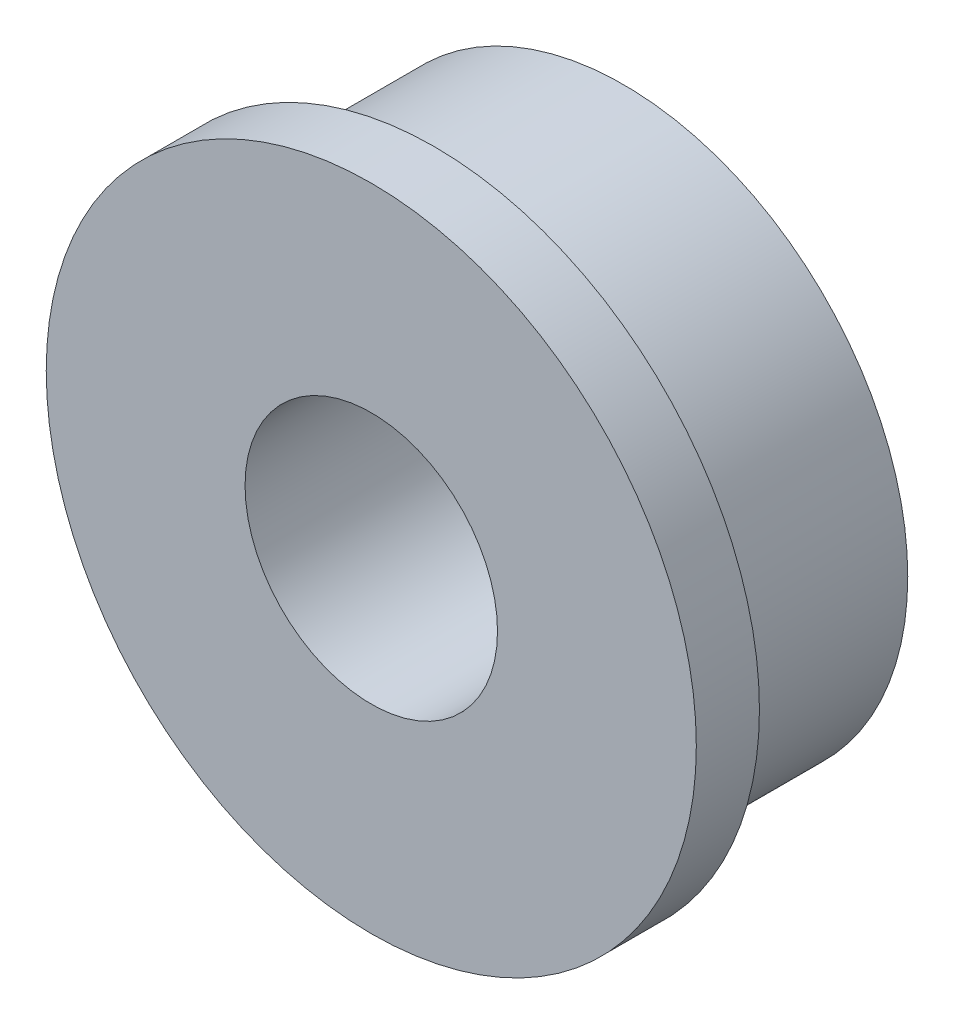
ISO-10303-21;
HEADER;
FILE_DESCRIPTION(('STEP AP214'),'2;1');
FILE_NAME('part.step','',(''),(''),'','','');
FILE_SCHEMA(('AUTOMOTIVE_DESIGN { 1 0 10303 214 1 1 1 1 }'));
ENDSEC;
DATA;
#1=APPLICATION_CONTEXT('core data for automotive mechanical design processes');
#2=APPLICATION_PROTOCOL_DEFINITION('international standard','automotive_design',2000,#1);
#3=PRODUCT_CONTEXT('',#1,'mechanical');
#4=PRODUCT('Part','Part','',(#3));
#5=PRODUCT_RELATED_PRODUCT_CATEGORY('part','',(#4));
#6=PRODUCT_DEFINITION_FORMATION('','',#4);
#7=PRODUCT_DEFINITION_CONTEXT('part definition',#1,'design');
#8=PRODUCT_DEFINITION('design','',#6,#7);
#9=PRODUCT_DEFINITION_SHAPE('','',#8);
#10=(LENGTH_UNIT() NAMED_UNIT(*) SI_UNIT(.MILLI.,.METRE.));
#11=(NAMED_UNIT(*) PLANE_ANGLE_UNIT() SI_UNIT($,.RADIAN.));
#12=(NAMED_UNIT(*) SI_UNIT($,.STERADIAN.) SOLID_ANGLE_UNIT());
#13=UNCERTAINTY_MEASURE_WITH_UNIT(LENGTH_MEASURE(1.E-05),#10,'distance_accuracy_value','');
#14=(GEOMETRIC_REPRESENTATION_CONTEXT(3) GLOBAL_UNCERTAINTY_ASSIGNED_CONTEXT((#13)) GLOBAL_UNIT_ASSIGNED_CONTEXT((#10,
#11,#12)) REPRESENTATION_CONTEXT('',''));
#15=CARTESIAN_POINT('',(0.,0.,0.));
#16=DIRECTION('',(0.,0.,1.));
#17=DIRECTION('',(1.,0.,0.));
#18=AXIS2_PLACEMENT_3D('',#15,#16,#17);
#19=CARTESIAN_POINT('',(0.,0.,0.));
#20=DIRECTION('',(0.,0.,1.));
#21=DIRECTION('',(1.,0.,0.));
#22=AXIS2_PLACEMENT_3D('',#19,#20,#21);
#23=PLANE('',#22);
#24=CARTESIAN_POINT('',(0.,0.,0.));
#25=DIRECTION('',(0.,0.,1.));
#26=DIRECTION('',(1.,0.,0.));
#27=AXIS2_PLACEMENT_3D('',#24,#25,#26);
#28=CIRCLE('',#27,4.5);
#29=CARTESIAN_POINT('',(4.5,0.,0.));
#30=VERTEX_POINT('',#29);
#31=EDGE_CURVE('E41',#30,#30,#28,.T.);
#32=ORIENTED_EDGE('',*,*,#31,.F.);
#33=EDGE_LOOP('',(#32));
#34=FACE_BOUND('',#33,.T.);
#35=CARTESIAN_POINT('',(0.,0.,0.));
#36=DIRECTION('',(0.,0.,1.));
#37=DIRECTION('',(1.,0.,0.));
#38=AXIS2_PLACEMENT_3D('',#35,#36,#37);
#39=CIRCLE('',#38,2.);
#40=CARTESIAN_POINT('',(2.,0.,0.));
#41=VERTEX_POINT('',#40);
#42=EDGE_CURVE('E48',#41,#41,#39,.T.);
#43=ORIENTED_EDGE('',*,*,#42,.T.);
#44=EDGE_LOOP('',(#43));
#45=FACE_BOUND('',#44,.T.);
#46=ADVANCED_FACE('F37',(#34,#45),#23,.F.);
#47=CARTESIAN_POINT('',(0.,0.,3.));
#48=DIRECTION('',(0.,0.,-1.));
#49=DIRECTION('',(-1.,0.,0.));
#50=AXIS2_PLACEMENT_3D('',#47,#48,#49);
#51=CYLINDRICAL_SURFACE('',#50,4.5);
#52=CARTESIAN_POINT('',(0.,0.,3.));
#53=DIRECTION('',(0.,0.,1.));
#54=DIRECTION('',(1.,0.,0.));
#55=AXIS2_PLACEMENT_3D('',#52,#53,#54);
#56=CIRCLE('',#55,4.5);
#57=CARTESIAN_POINT('',(4.5,0.,3.));
#58=VERTEX_POINT('',#57);
#59=EDGE_CURVE('E10',#58,#58,#56,.T.);
#60=ORIENTED_EDGE('',*,*,#59,.F.);
#61=EDGE_LOOP('',(#60));
#62=FACE_BOUND('',#61,.T.);
#63=ORIENTED_EDGE('',*,*,#31,.T.);
#64=EDGE_LOOP('',(#63));
#65=FACE_BOUND('',#64,.T.);
#66=ADVANCED_FACE('F39',(#62,#65),#51,.T.);
#67=CARTESIAN_POINT('',(0.,0.,3.));
#68=DIRECTION('',(0.,0.,-1.));
#69=DIRECTION('',(-1.,0.,0.));
#70=AXIS2_PLACEMENT_3D('',#67,#68,#69);
#71=CYLINDRICAL_SURFACE('',#70,2.);
#72=ORIENTED_EDGE('',*,*,#42,.F.);
#73=EDGE_LOOP('',(#72));
#74=FACE_BOUND('',#73,.T.);
#75=CARTESIAN_POINT('',(0.,0.,4.));
#76=DIRECTION('',(0.,0.,1.));
#77=DIRECTION('',(1.,0.,0.));
#78=AXIS2_PLACEMENT_3D('',#75,#76,#77);
#79=CIRCLE('',#78,2.);
#80=CARTESIAN_POINT('',(2.,0.,4.));
#81=VERTEX_POINT('',#80);
#82=EDGE_CURVE('E56',#81,#81,#79,.T.);
#83=ORIENTED_EDGE('',*,*,#82,.T.);
#84=EDGE_LOOP('',(#83));
#85=FACE_BOUND('',#84,.T.);
#86=ADVANCED_FACE('F62',(#74,#85),#71,.F.);
#87=CARTESIAN_POINT('',(0.,0.,4.));
#88=DIRECTION('',(0.,0.,1.));
#89=DIRECTION('',(1.,0.,0.));
#90=AXIS2_PLACEMENT_3D('',#87,#88,#89);
#91=PLANE('',#90);
#92=CARTESIAN_POINT('',(0.,0.,4.));
#93=DIRECTION('',(0.,0.,1.));
#94=DIRECTION('',(1.,0.,0.));
#95=AXIS2_PLACEMENT_3D('',#92,#93,#94);
#96=CIRCLE('',#95,5.15);
#97=CARTESIAN_POINT('',(5.15,0.,4.));
#98=VERTEX_POINT('',#97);
#99=EDGE_CURVE('E52',#98,#98,#96,.T.);
#100=ORIENTED_EDGE('',*,*,#99,.T.);
#101=EDGE_LOOP('',(#100));
#102=FACE_BOUND('',#101,.T.);
#103=ORIENTED_EDGE('',*,*,#82,.F.);
#104=EDGE_LOOP('',(#103));
#105=FACE_BOUND('',#104,.T.);
#106=ADVANCED_FACE('F64',(#102,#105),#91,.T.);
#107=CARTESIAN_POINT('',(0.,0.,3.));
#108=DIRECTION('',(0.,0.,1.));
#109=DIRECTION('',(1.,0.,0.));
#110=AXIS2_PLACEMENT_3D('',#107,#108,#109);
#111=PLANE('',#110);
#112=ORIENTED_EDGE('',*,*,#59,.T.);
#113=EDGE_LOOP('',(#112));
#114=FACE_BOUND('',#113,.T.);
#115=CARTESIAN_POINT('',(0.,0.,3.));
#116=DIRECTION('',(0.,0.,1.));
#117=DIRECTION('',(1.,0.,0.));
#118=AXIS2_PLACEMENT_3D('',#115,#116,#117);
#119=CIRCLE('',#118,5.15);
#120=CARTESIAN_POINT('',(5.15,0.,3.));
#121=VERTEX_POINT('',#120);
#122=EDGE_CURVE('E53',#121,#121,#119,.T.);
#123=ORIENTED_EDGE('',*,*,#122,.F.);
#124=EDGE_LOOP('',(#123));
#125=FACE_BOUND('',#124,.T.);
#126=ADVANCED_FACE('F66',(#114,#125),#111,.F.);
#127=CARTESIAN_POINT('',(0.,0.,4.));
#128=DIRECTION('',(0.,0.,-1.));
#129=DIRECTION('',(-1.,0.,0.));
#130=AXIS2_PLACEMENT_3D('',#127,#128,#129);
#131=CYLINDRICAL_SURFACE('',#130,5.15);
#132=ORIENTED_EDGE('',*,*,#99,.F.);
#133=EDGE_LOOP('',(#132));
#134=FACE_BOUND('',#133,.T.);
#135=ORIENTED_EDGE('',*,*,#122,.T.);
#136=EDGE_LOOP('',(#135));
#137=FACE_BOUND('',#136,.T.);
#138=ADVANCED_FACE('F73',(#134,#137),#131,.T.);
#139=CLOSED_SHELL('',(#46,#66,#86,#106,#126,#138));
#140=MANIFOLD_SOLID_BREP('B2',#139);
#141=ADVANCED_BREP_SHAPE_REPRESENTATION('',(#18,#140),#14);
#142=SHAPE_DEFINITION_REPRESENTATION(#9,#141);
ENDSEC;
END-ISO-10303-21;
